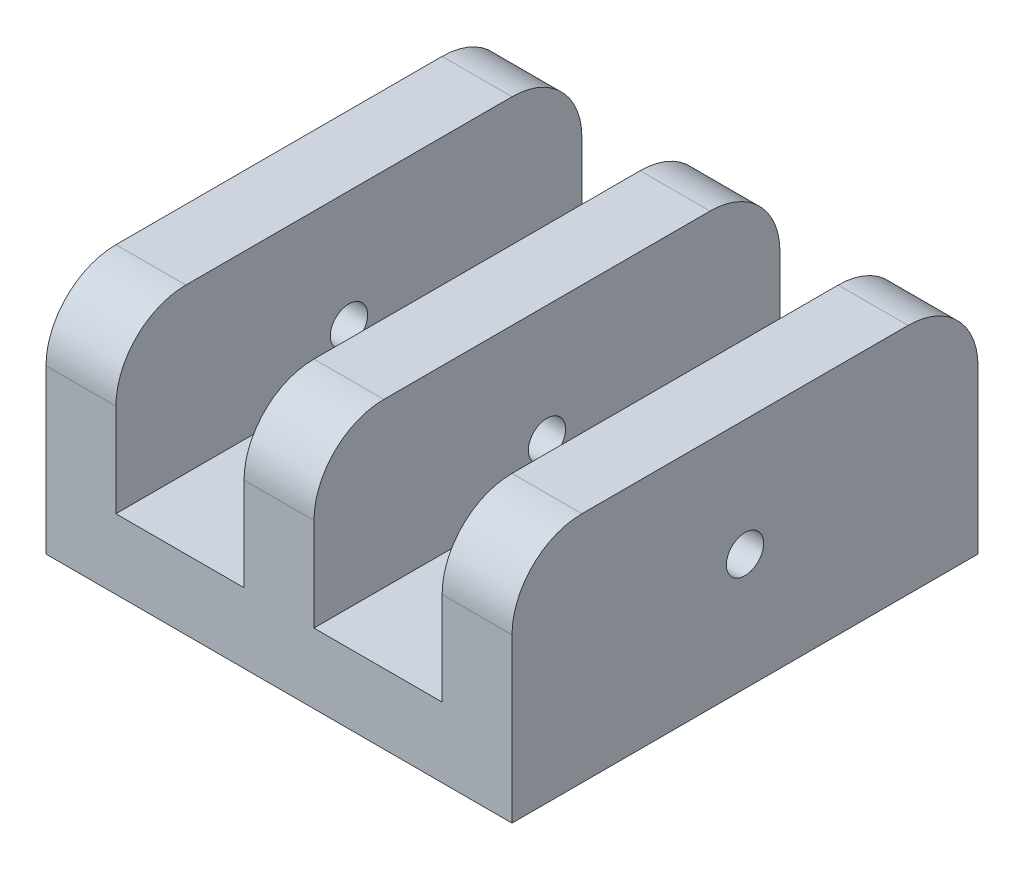
ISO-10303-21;
HEADER;
FILE_DESCRIPTION(('STEP AP214'),'2;1');
FILE_NAME('part.step','',(''),(''),'','','');
FILE_SCHEMA(('AUTOMOTIVE_DESIGN { 1 0 10303 214 1 1 1 1 }'));
ENDSEC;
DATA;
#1=APPLICATION_CONTEXT('core data for automotive mechanical design processes');
#2=APPLICATION_PROTOCOL_DEFINITION('international standard','automotive_design',2000,#1);
#3=PRODUCT_CONTEXT('',#1,'mechanical');
#4=PRODUCT('Part','Part','',(#3));
#5=PRODUCT_RELATED_PRODUCT_CATEGORY('part','',(#4));
#6=PRODUCT_DEFINITION_FORMATION('','',#4);
#7=PRODUCT_DEFINITION_CONTEXT('part definition',#1,'design');
#8=PRODUCT_DEFINITION('design','',#6,#7);
#9=PRODUCT_DEFINITION_SHAPE('','',#8);
#10=(LENGTH_UNIT() NAMED_UNIT(*) SI_UNIT(.MILLI.,.METRE.));
#11=(NAMED_UNIT(*) PLANE_ANGLE_UNIT() SI_UNIT($,.RADIAN.));
#12=(NAMED_UNIT(*) SI_UNIT($,.STERADIAN.) SOLID_ANGLE_UNIT());
#13=UNCERTAINTY_MEASURE_WITH_UNIT(LENGTH_MEASURE(1.E-05),#10,'distance_accuracy_value','');
#14=(GEOMETRIC_REPRESENTATION_CONTEXT(3) GLOBAL_UNCERTAINTY_ASSIGNED_CONTEXT((#13)) GLOBAL_UNIT_ASSIGNED_CONTEXT((#10,
#11,#12)) REPRESENTATION_CONTEXT('',''));
#15=CARTESIAN_POINT('',(0.,0.,0.));
#16=DIRECTION('',(0.,0.,1.));
#17=DIRECTION('',(1.,0.,0.));
#18=AXIS2_PLACEMENT_3D('',#15,#16,#17);
#19=CARTESIAN_POINT('',(0.,0.,50.8));
#20=DIRECTION('',(0.,0.,1.));
#21=DIRECTION('',(1.,0.,0.));
#22=AXIS2_PLACEMENT_3D('',#19,#20,#21);
#23=PLANE('',#22);
#24=DIRECTION('',(0.,1.,0.));
#25=VECTOR('',#24,1.);
#26=CARTESIAN_POINT('',(7.62,7.62,50.8));
#27=LINE('',#26,#25);
#28=CARTESIAN_POINT('',(7.62,7.62,50.8));
#29=VERTEX_POINT('',#28);
#30=CARTESIAN_POINT('',(7.62,17.78,50.8));
#31=VERTEX_POINT('',#30);
#32=EDGE_CURVE('E267',#29,#31,#27,.T.);
#33=ORIENTED_EDGE('',*,*,#32,.T.);
#34=DIRECTION('',(-1.,0.,0.));
#35=VECTOR('',#34,1.);
#36=CARTESIAN_POINT('',(0.,17.78,50.8));
#37=LINE('',#36,#35);
#38=CARTESIAN_POINT('',(0.,17.78,50.8));
#39=VERTEX_POINT('',#38);
#40=EDGE_CURVE('E351',#31,#39,#37,.T.);
#41=ORIENTED_EDGE('',*,*,#40,.T.);
#42=DIRECTION('',(0.,-1.,0.));
#43=VECTOR('',#42,1.);
#44=CARTESIAN_POINT('',(0.,25.4,50.8));
#45=LINE('',#44,#43);
#46=CARTESIAN_POINT('',(0.,0.,50.8));
#47=VERTEX_POINT('',#46);
#48=EDGE_CURVE('E181',#39,#47,#45,.T.);
#49=ORIENTED_EDGE('',*,*,#48,.T.);
#50=DIRECTION('',(1.,0.,0.));
#51=VECTOR('',#50,1.);
#52=CARTESIAN_POINT('',(0.,0.,50.8));
#53=LINE('',#52,#51);
#54=CARTESIAN_POINT('',(50.8,0.,50.8));
#55=VERTEX_POINT('',#54);
#56=EDGE_CURVE('E184',#47,#55,#53,.T.);
#57=ORIENTED_EDGE('',*,*,#56,.T.);
#58=DIRECTION('',(0.,1.,0.));
#59=VECTOR('',#58,1.);
#60=CARTESIAN_POINT('',(50.8,0.,50.8));
#61=LINE('',#60,#59);
#62=CARTESIAN_POINT('',(50.8,17.78,50.8));
#63=VERTEX_POINT('',#62);
#64=EDGE_CURVE('E199',#55,#63,#61,.T.);
#65=ORIENTED_EDGE('',*,*,#64,.T.);
#66=DIRECTION('',(-1.,0.,0.));
#67=VECTOR('',#66,1.);
#68=CARTESIAN_POINT('',(0.,17.78,50.8));
#69=LINE('',#68,#67);
#70=CARTESIAN_POINT('',(43.18,17.78,50.8));
#71=VERTEX_POINT('',#70);
#72=EDGE_CURVE('E169',#63,#71,#69,.T.);
#73=ORIENTED_EDGE('',*,*,#72,.T.);
#74=DIRECTION('',(0.,-1.,0.));
#75=VECTOR('',#74,1.);
#76=CARTESIAN_POINT('',(43.18,25.4,50.8));
#77=LINE('',#76,#75);
#78=CARTESIAN_POINT('',(43.18,7.62000000000001,50.8));
#79=VERTEX_POINT('',#78);
#80=EDGE_CURVE('E234',#71,#79,#77,.T.);
#81=ORIENTED_EDGE('',*,*,#80,.T.);
#82=DIRECTION('',(-1.,0.,0.));
#83=VECTOR('',#82,1.);
#84=CARTESIAN_POINT('',(43.18,7.62000000000001,50.8));
#85=LINE('',#84,#83);
#86=CARTESIAN_POINT('',(29.21,7.62,50.8));
#87=VERTEX_POINT('',#86);
#88=EDGE_CURVE('E318',#79,#87,#85,.T.);
#89=ORIENTED_EDGE('',*,*,#88,.T.);
#90=DIRECTION('',(0.,1.,0.));
#91=VECTOR('',#90,1.);
#92=CARTESIAN_POINT('',(29.21,7.62,50.8));
#93=LINE('',#92,#91);
#94=CARTESIAN_POINT('',(29.21,17.78,50.8));
#95=VERTEX_POINT('',#94);
#96=EDGE_CURVE('E309',#87,#95,#93,.T.);
#97=ORIENTED_EDGE('',*,*,#96,.T.);
#98=DIRECTION('',(-1.,0.,0.));
#99=VECTOR('',#98,1.);
#100=CARTESIAN_POINT('',(0.,17.78,50.8));
#101=LINE('',#100,#99);
#102=CARTESIAN_POINT('',(21.59,17.78,50.8));
#103=VERTEX_POINT('',#102);
#104=EDGE_CURVE('E350',#95,#103,#101,.T.);
#105=ORIENTED_EDGE('',*,*,#104,.T.);
#106=DIRECTION('',(0.,-1.,0.));
#107=VECTOR('',#106,1.);
#108=CARTESIAN_POINT('',(21.59,25.4,50.8));
#109=LINE('',#108,#107);
#110=CARTESIAN_POINT('',(21.59,7.62000000000001,50.8));
#111=VERTEX_POINT('',#110);
#112=EDGE_CURVE('E239',#103,#111,#109,.T.);
#113=ORIENTED_EDGE('',*,*,#112,.T.);
#114=DIRECTION('',(-1.,0.,0.));
#115=VECTOR('',#114,1.);
#116=CARTESIAN_POINT('',(21.59,7.62000000000001,50.8));
#117=LINE('',#116,#115);
#118=EDGE_CURVE('E253',#111,#29,#117,.T.);
#119=ORIENTED_EDGE('',*,*,#118,.T.);
#120=EDGE_LOOP('',(#33,#41,#49,#57,#65,#73,#81,#89,#97,#105,#113,#119));
#121=FACE_BOUND('',#120,.T.);
#122=ADVANCED_FACE('F34',(#121),#23,.T.);
#123=CARTESIAN_POINT('',(0.,0.,0.));
#124=DIRECTION('',(0.,0.,1.));
#125=DIRECTION('',(1.,0.,0.));
#126=AXIS2_PLACEMENT_3D('',#123,#124,#125);
#127=PLANE('',#126);
#128=DIRECTION('',(0.,-1.,0.));
#129=VECTOR('',#128,1.);
#130=CARTESIAN_POINT('',(43.18,25.4,0.));
#131=LINE('',#130,#129);
#132=CARTESIAN_POINT('',(43.18,17.78,0.));
#133=VERTEX_POINT('',#132);
#134=CARTESIAN_POINT('',(43.18,7.62000000000001,0.));
#135=VERTEX_POINT('',#134);
#136=EDGE_CURVE('E217',#133,#135,#131,.T.);
#137=ORIENTED_EDGE('',*,*,#136,.F.);
#138=DIRECTION('',(-1.,0.,0.));
#139=VECTOR('',#138,1.);
#140=CARTESIAN_POINT('',(50.8,17.78,0.));
#141=LINE('',#140,#139);
#142=CARTESIAN_POINT('',(50.8,17.78,0.));
#143=VERTEX_POINT('',#142);
#144=EDGE_CURVE('E295',#133,#143,#141,.F.);
#145=ORIENTED_EDGE('',*,*,#144,.T.);
#146=DIRECTION('',(0.,1.,0.));
#147=VECTOR('',#146,1.);
#148=CARTESIAN_POINT('',(50.8,0.,0.));
#149=LINE('',#148,#147);
#150=CARTESIAN_POINT('',(50.8,0.,0.));
#151=VERTEX_POINT('',#150);
#152=EDGE_CURVE('E177',#151,#143,#149,.T.);
#153=ORIENTED_EDGE('',*,*,#152,.F.);
#154=DIRECTION('',(1.,0.,0.));
#155=VECTOR('',#154,1.);
#156=CARTESIAN_POINT('',(0.,0.,0.));
#157=LINE('',#156,#155);
#158=CARTESIAN_POINT('',(0.,0.,0.));
#159=VERTEX_POINT('',#158);
#160=EDGE_CURVE('E173',#159,#151,#157,.T.);
#161=ORIENTED_EDGE('',*,*,#160,.F.);
#162=DIRECTION('',(0.,-1.,0.));
#163=VECTOR('',#162,1.);
#164=CARTESIAN_POINT('',(0.,25.4,0.));
#165=LINE('',#164,#163);
#166=CARTESIAN_POINT('',(0.,17.78,0.));
#167=VERTEX_POINT('',#166);
#168=EDGE_CURVE('E160',#167,#159,#165,.T.);
#169=ORIENTED_EDGE('',*,*,#168,.F.);
#170=DIRECTION('',(-1.,0.,0.));
#171=VECTOR('',#170,1.);
#172=CARTESIAN_POINT('',(7.62,17.78,0.));
#173=LINE('',#172,#171);
#174=CARTESIAN_POINT('',(7.62,17.78,0.));
#175=VERTEX_POINT('',#174);
#176=EDGE_CURVE('E291',#167,#175,#173,.F.);
#177=ORIENTED_EDGE('',*,*,#176,.T.);
#178=DIRECTION('',(0.,1.,0.));
#179=VECTOR('',#178,1.);
#180=CARTESIAN_POINT('',(7.62,7.62,0.));
#181=LINE('',#180,#179);
#182=CARTESIAN_POINT('',(7.62,7.62,0.));
#183=VERTEX_POINT('',#182);
#184=EDGE_CURVE('E266',#183,#175,#181,.T.);
#185=ORIENTED_EDGE('',*,*,#184,.F.);
#186=DIRECTION('',(-1.,0.,0.));
#187=VECTOR('',#186,1.);
#188=CARTESIAN_POINT('',(21.59,7.62000000000001,0.));
#189=LINE('',#188,#187);
#190=CARTESIAN_POINT('',(21.59,7.62000000000001,0.));
#191=VERTEX_POINT('',#190);
#192=EDGE_CURVE('E243',#191,#183,#189,.T.);
#193=ORIENTED_EDGE('',*,*,#192,.F.);
#194=DIRECTION('',(0.,-1.,0.));
#195=VECTOR('',#194,1.);
#196=CARTESIAN_POINT('',(21.59,25.4,0.));
#197=LINE('',#196,#195);
#198=CARTESIAN_POINT('',(21.59,17.78,0.));
#199=VERTEX_POINT('',#198);
#200=EDGE_CURVE('E290',#199,#191,#197,.T.);
#201=ORIENTED_EDGE('',*,*,#200,.F.);
#202=DIRECTION('',(-1.,0.,0.));
#203=VECTOR('',#202,1.);
#204=CARTESIAN_POINT('',(29.21,17.78,0.));
#205=LINE('',#204,#203);
#206=CARTESIAN_POINT('',(29.21,17.78,0.));
#207=VERTEX_POINT('',#206);
#208=EDGE_CURVE('E293',#199,#207,#205,.F.);
#209=ORIENTED_EDGE('',*,*,#208,.T.);
#210=DIRECTION('',(0.,1.,0.));
#211=VECTOR('',#210,1.);
#212=CARTESIAN_POINT('',(29.21,7.62,0.));
#213=LINE('',#212,#211);
#214=CARTESIAN_POINT('',(29.21,7.62,0.));
#215=VERTEX_POINT('',#214);
#216=EDGE_CURVE('E315',#215,#207,#213,.T.);
#217=ORIENTED_EDGE('',*,*,#216,.F.);
#218=DIRECTION('',(-1.,0.,0.));
#219=VECTOR('',#218,1.);
#220=CARTESIAN_POINT('',(43.18,7.62000000000001,0.));
#221=LINE('',#220,#219);
#222=EDGE_CURVE('E237',#135,#215,#221,.T.);
#223=ORIENTED_EDGE('',*,*,#222,.F.);
#224=EDGE_LOOP('',(#137,#145,#153,#161,#169,#177,#185,#193,#201,#209,#217,#223));
#225=FACE_BOUND('',#224,.T.);
#226=ADVANCED_FACE('F175',(#225),#127,.F.);
#227=CARTESIAN_POINT('',(7.62,7.62,0.));
#228=DIRECTION('',(1.,0.,0.));
#229=DIRECTION('',(0.,1.,0.));
#230=AXIS2_PLACEMENT_3D('',#227,#228,#229);
#231=PLANE('',#230);
#232=CARTESIAN_POINT('',(7.62,12.7,25.4));
#233=DIRECTION('',(1.,0.,0.));
#234=DIRECTION('',(0.,1.,0.));
#235=AXIS2_PLACEMENT_3D('',#232,#233,#234);
#236=CIRCLE('',#235,2.032);
#237=CARTESIAN_POINT('',(7.62,14.732,25.4));
#238=VERTEX_POINT('',#237);
#239=EDGE_CURVE('E459',#238,#238,#236,.T.);
#240=ORIENTED_EDGE('',*,*,#239,.F.);
#241=EDGE_LOOP('',(#240));
#242=FACE_BOUND('',#241,.T.);
#243=ORIENTED_EDGE('',*,*,#184,.T.);
#244=CARTESIAN_POINT('',(7.62,17.78,7.62));
#245=DIRECTION('',(1.,0.,0.));
#246=DIRECTION('',(0.,1.,0.));
#247=AXIS2_PLACEMENT_3D('',#244,#245,#246);
#248=CIRCLE('',#247,7.62);
#249=CARTESIAN_POINT('',(7.62,25.4,7.62));
#250=VERTEX_POINT('',#249);
#251=EDGE_CURVE('E12',#175,#250,#248,.T.);
#252=ORIENTED_EDGE('',*,*,#251,.T.);
#253=DIRECTION('',(0.,0.,1.));
#254=VECTOR('',#253,1.);
#255=CARTESIAN_POINT('',(7.62,25.4,0.));
#256=LINE('',#255,#254);
#257=CARTESIAN_POINT('',(7.62,25.4,43.18));
#258=VERTEX_POINT('',#257);
#259=EDGE_CURVE('E261',#250,#258,#256,.T.);
#260=ORIENTED_EDGE('',*,*,#259,.T.);
#261=CARTESIAN_POINT('',(7.62,17.78,43.18));
#262=DIRECTION('',(1.,0.,0.));
#263=DIRECTION('',(0.,1.,0.));
#264=AXIS2_PLACEMENT_3D('',#261,#262,#263);
#265=CIRCLE('',#264,7.62);
#266=EDGE_CURVE('E361',#258,#31,#265,.T.);
#267=ORIENTED_EDGE('',*,*,#266,.T.);
#268=ORIENTED_EDGE('',*,*,#32,.F.);
#269=DIRECTION('',(0.,0.,1.));
#270=VECTOR('',#269,1.);
#271=CARTESIAN_POINT('',(7.62,7.62,0.));
#272=LINE('',#271,#270);
#273=EDGE_CURVE('E264',#183,#29,#272,.T.);
#274=ORIENTED_EDGE('',*,*,#273,.F.);
#275=EDGE_LOOP('',(#243,#252,#260,#267,#268,#274));
#276=FACE_BOUND('',#275,.T.);
#277=ADVANCED_FACE('F414',(#242,#276),#231,.T.);
#278=CARTESIAN_POINT('',(21.59,7.62000000000001,0.));
#279=DIRECTION('',(0.,1.,0.));
#280=DIRECTION('',(-1.,0.,0.));
#281=AXIS2_PLACEMENT_3D('',#278,#279,#280);
#282=PLANE('',#281);
#283=CARTESIAN_POINT('',(14.605,7.62,25.4));
#284=DIRECTION('',(0.,1.,0.));
#285=DIRECTION('',(-1.,0.,0.));
#286=AXIS2_PLACEMENT_3D('',#283,#284,#285);
#287=CIRCLE('',#286,0.5334);
#288=CARTESIAN_POINT('',(14.0716,7.62,25.4));
#289=VERTEX_POINT('',#288);
#290=EDGE_CURVE('E281',#289,#289,#287,.T.);
#291=ORIENTED_EDGE('',*,*,#290,.F.);
#292=EDGE_LOOP('',(#291));
#293=FACE_BOUND('',#292,.T.);
#294=ORIENTED_EDGE('',*,*,#118,.F.);
#295=DIRECTION('',(0.,0.,1.));
#296=VECTOR('',#295,1.);
#297=CARTESIAN_POINT('',(21.59,7.62000000000001,0.));
#298=LINE('',#297,#296);
#299=EDGE_CURVE('E250',#191,#111,#298,.T.);
#300=ORIENTED_EDGE('',*,*,#299,.F.);
#301=ORIENTED_EDGE('',*,*,#192,.T.);
#302=ORIENTED_EDGE('',*,*,#273,.T.);
#303=EDGE_LOOP('',(#294,#300,#301,#302));
#304=FACE_BOUND('',#303,.T.);
#305=ADVANCED_FACE('F436',(#293,#304),#282,.T.);
#306=CARTESIAN_POINT('',(21.59,25.4,0.));
#307=DIRECTION('',(-1.,0.,0.));
#308=DIRECTION('',(0.,-1.,0.));
#309=AXIS2_PLACEMENT_3D('',#306,#307,#308);
#310=PLANE('',#309);
#311=CARTESIAN_POINT('',(21.59,12.7,25.4));
#312=DIRECTION('',(-1.,0.,0.));
#313=DIRECTION('',(0.,-1.,0.));
#314=AXIS2_PLACEMENT_3D('',#311,#312,#313);
#315=CIRCLE('',#314,2.032);
#316=CARTESIAN_POINT('',(21.59,10.668,25.4));
#317=VERTEX_POINT('',#316);
#318=EDGE_CURVE('E462',#317,#317,#315,.T.);
#319=ORIENTED_EDGE('',*,*,#318,.F.);
#320=EDGE_LOOP('',(#319));
#321=FACE_BOUND('',#320,.T.);
#322=DIRECTION('',(0.,0.,1.));
#323=VECTOR('',#322,1.);
#324=CARTESIAN_POINT('',(21.59,25.4,0.));
#325=LINE('',#324,#323);
#326=CARTESIAN_POINT('',(21.59,25.4,7.62));
#327=VERTEX_POINT('',#326);
#328=CARTESIAN_POINT('',(21.59,25.4,43.18));
#329=VERTEX_POINT('',#328);
#330=EDGE_CURVE('E242',#327,#329,#325,.T.);
#331=ORIENTED_EDGE('',*,*,#330,.F.);
#332=CARTESIAN_POINT('',(21.59,17.78,7.62));
#333=DIRECTION('',(-1.,0.,0.));
#334=DIRECTION('',(0.,-1.,0.));
#335=AXIS2_PLACEMENT_3D('',#332,#333,#334);
#336=CIRCLE('',#335,7.62);
#337=EDGE_CURVE('E678',#327,#199,#336,.T.);
#338=ORIENTED_EDGE('',*,*,#337,.T.);
#339=ORIENTED_EDGE('',*,*,#200,.T.);
#340=ORIENTED_EDGE('',*,*,#299,.T.);
#341=ORIENTED_EDGE('',*,*,#112,.F.);
#342=CARTESIAN_POINT('',(21.59,17.78,43.18));
#343=DIRECTION('',(-1.,0.,0.));
#344=DIRECTION('',(0.,-1.,0.));
#345=AXIS2_PLACEMENT_3D('',#342,#343,#344);
#346=CIRCLE('',#345,7.62);
#347=EDGE_CURVE('E363',#103,#329,#346,.T.);
#348=ORIENTED_EDGE('',*,*,#347,.T.);
#349=EDGE_LOOP('',(#331,#338,#339,#340,#341,#348));
#350=FACE_BOUND('',#349,.T.);
#351=ADVANCED_FACE('F434',(#321,#350),#310,.T.);
#352=CARTESIAN_POINT('',(29.21,25.4,0.));
#353=DIRECTION('',(0.,1.,0.));
#354=DIRECTION('',(0.,0.,1.));
#355=AXIS2_PLACEMENT_3D('',#352,#353,#354);
#356=PLANE('',#355);
#357=DIRECTION('',(0.,0.,1.));
#358=VECTOR('',#357,1.);
#359=CARTESIAN_POINT('',(29.21,25.4,0.));
#360=LINE('',#359,#358);
#361=CARTESIAN_POINT('',(29.21,25.4,7.62));
#362=VERTEX_POINT('',#361);
#363=CARTESIAN_POINT('',(29.21,25.4,43.18));
#364=VERTEX_POINT('',#363);
#365=EDGE_CURVE('E301',#362,#364,#360,.T.);
#366=ORIENTED_EDGE('',*,*,#365,.F.);
#367=DIRECTION('',(-1.,0.,0.));
#368=VECTOR('',#367,1.);
#369=CARTESIAN_POINT('',(21.59,25.4,7.62));
#370=LINE('',#369,#368);
#371=EDGE_CURVE('E299',#362,#327,#370,.T.);
#372=ORIENTED_EDGE('',*,*,#371,.T.);
#373=ORIENTED_EDGE('',*,*,#330,.T.);
#374=DIRECTION('',(-1.,0.,0.));
#375=VECTOR('',#374,1.);
#376=CARTESIAN_POINT('',(29.21,25.4,43.18));
#377=LINE('',#376,#375);
#378=EDGE_CURVE('E366',#329,#364,#377,.F.);
#379=ORIENTED_EDGE('',*,*,#378,.T.);
#380=EDGE_LOOP('',(#366,#372,#373,#379));
#381=FACE_BOUND('',#380,.T.);
#382=ADVANCED_FACE('F431',(#381),#356,.T.);
#383=CARTESIAN_POINT('',(29.21,7.62,0.));
#384=DIRECTION('',(1.,0.,0.));
#385=DIRECTION('',(0.,1.,0.));
#386=AXIS2_PLACEMENT_3D('',#383,#384,#385);
#387=PLANE('',#386);
#388=CARTESIAN_POINT('',(29.21,12.7,25.4));
#389=DIRECTION('',(1.,0.,0.));
#390=DIRECTION('',(0.,1.,0.));
#391=AXIS2_PLACEMENT_3D('',#388,#389,#390);
#392=CIRCLE('',#391,2.032);
#393=CARTESIAN_POINT('',(29.21,14.732,25.4));
#394=VERTEX_POINT('',#393);
#395=EDGE_CURVE('E465',#394,#394,#392,.T.);
#396=ORIENTED_EDGE('',*,*,#395,.F.);
#397=EDGE_LOOP('',(#396));
#398=FACE_BOUND('',#397,.T.);
#399=ORIENTED_EDGE('',*,*,#216,.T.);
#400=CARTESIAN_POINT('',(29.21,17.78,7.62));
#401=DIRECTION('',(1.,0.,0.));
#402=DIRECTION('',(0.,1.,0.));
#403=AXIS2_PLACEMENT_3D('',#400,#401,#402);
#404=CIRCLE('',#403,7.62);
#405=EDGE_CURVE('E427',#207,#362,#404,.T.);
#406=ORIENTED_EDGE('',*,*,#405,.T.);
#407=ORIENTED_EDGE('',*,*,#365,.T.);
#408=CARTESIAN_POINT('',(29.21,17.78,43.18));
#409=DIRECTION('',(1.,0.,0.));
#410=DIRECTION('',(0.,1.,0.));
#411=AXIS2_PLACEMENT_3D('',#408,#409,#410);
#412=CIRCLE('',#411,7.62);
#413=EDGE_CURVE('E369',#364,#95,#412,.T.);
#414=ORIENTED_EDGE('',*,*,#413,.T.);
#415=ORIENTED_EDGE('',*,*,#96,.F.);
#416=DIRECTION('',(0.,0.,1.));
#417=VECTOR('',#416,1.);
#418=CARTESIAN_POINT('',(29.21,7.62,0.));
#419=LINE('',#418,#417);
#420=EDGE_CURVE('E312',#215,#87,#419,.T.);
#421=ORIENTED_EDGE('',*,*,#420,.F.);
#422=EDGE_LOOP('',(#399,#406,#407,#414,#415,#421));
#423=FACE_BOUND('',#422,.T.);
#424=ADVANCED_FACE('F424',(#398,#423),#387,.T.);
#425=CARTESIAN_POINT('',(43.18,7.62000000000001,0.));
#426=DIRECTION('',(0.,1.,0.));
#427=DIRECTION('',(-1.,0.,0.));
#428=AXIS2_PLACEMENT_3D('',#425,#426,#427);
#429=PLANE('',#428);
#430=CARTESIAN_POINT('',(36.195,7.62000000000001,25.4));
#431=DIRECTION('',(0.,1.,0.));
#432=DIRECTION('',(-1.,0.,0.));
#433=AXIS2_PLACEMENT_3D('',#430,#431,#432);
#434=CIRCLE('',#433,0.533400000000005);
#435=CARTESIAN_POINT('',(35.6616,7.62000000000001,25.4));
#436=VERTEX_POINT('',#435);
#437=EDGE_CURVE('E456',#436,#436,#434,.T.);
#438=ORIENTED_EDGE('',*,*,#437,.F.);
#439=EDGE_LOOP('',(#438));
#440=FACE_BOUND('',#439,.T.);
#441=ORIENTED_EDGE('',*,*,#88,.F.);
#442=DIRECTION('',(0.,0.,1.));
#443=VECTOR('',#442,1.);
#444=CARTESIAN_POINT('',(43.18,7.62000000000001,0.));
#445=LINE('',#444,#443);
#446=EDGE_CURVE('E231',#135,#79,#445,.T.);
#447=ORIENTED_EDGE('',*,*,#446,.F.);
#448=ORIENTED_EDGE('',*,*,#222,.T.);
#449=ORIENTED_EDGE('',*,*,#420,.T.);
#450=EDGE_LOOP('',(#441,#447,#448,#449));
#451=FACE_BOUND('',#450,.T.);
#452=ADVANCED_FACE('F340',(#440,#451),#429,.T.);
#453=CARTESIAN_POINT('',(43.18,25.4,0.));
#454=DIRECTION('',(-1.,0.,0.));
#455=DIRECTION('',(0.,0.,1.));
#456=AXIS2_PLACEMENT_3D('',#453,#454,#455);
#457=PLANE('',#456);
#458=CARTESIAN_POINT('',(43.18,12.7,25.4));
#459=DIRECTION('',(-1.,0.,0.));
#460=DIRECTION('',(0.,0.,1.));
#461=AXIS2_PLACEMENT_3D('',#458,#459,#460);
#462=CIRCLE('',#461,2.032);
#463=CARTESIAN_POINT('',(43.18,12.7,27.432));
#464=VERTEX_POINT('',#463);
#465=EDGE_CURVE('E468',#464,#464,#462,.T.);
#466=ORIENTED_EDGE('',*,*,#465,.F.);
#467=EDGE_LOOP('',(#466));
#468=FACE_BOUND('',#467,.T.);
#469=DIRECTION('',(0.,0.,1.));
#470=VECTOR('',#469,1.);
#471=CARTESIAN_POINT('',(43.18,25.4,0.));
#472=LINE('',#471,#470);
#473=CARTESIAN_POINT('',(43.18,25.4,7.62));
#474=VERTEX_POINT('',#473);
#475=CARTESIAN_POINT('',(43.18,25.4,43.18));
#476=VERTEX_POINT('',#475);
#477=EDGE_CURVE('E218',#474,#476,#472,.T.);
#478=ORIENTED_EDGE('',*,*,#477,.F.);
#479=CARTESIAN_POINT('',(43.18,17.78,7.62));
#480=DIRECTION('',(-1.,0.,0.));
#481=DIRECTION('',(0.,0.,1.));
#482=AXIS2_PLACEMENT_3D('',#479,#480,#481);
#483=CIRCLE('',#482,7.62);
#484=EDGE_CURVE('E223',#474,#133,#483,.T.);
#485=ORIENTED_EDGE('',*,*,#484,.T.);
#486=ORIENTED_EDGE('',*,*,#136,.T.);
#487=ORIENTED_EDGE('',*,*,#446,.T.);
#488=ORIENTED_EDGE('',*,*,#80,.F.);
#489=CARTESIAN_POINT('',(43.18,17.78,43.18));
#490=DIRECTION('',(-1.,0.,0.));
#491=DIRECTION('',(0.,0.,1.));
#492=AXIS2_PLACEMENT_3D('',#489,#490,#491);
#493=CIRCLE('',#492,7.62);
#494=EDGE_CURVE('E371',#71,#476,#493,.T.);
#495=ORIENTED_EDGE('',*,*,#494,.T.);
#496=EDGE_LOOP('',(#478,#485,#486,#487,#488,#495));
#497=FACE_BOUND('',#496,.T.);
#498=ADVANCED_FACE('F338',(#468,#497),#457,.T.);
#499=CARTESIAN_POINT('',(50.8,25.4,0.));
#500=DIRECTION('',(0.,1.,0.));
#501=DIRECTION('',(-1.,0.,0.));
#502=AXIS2_PLACEMENT_3D('',#499,#500,#501);
#503=PLANE('',#502);
#504=DIRECTION('',(0.,0.,1.));
#505=VECTOR('',#504,1.);
#506=CARTESIAN_POINT('',(50.8,25.4,0.));
#507=LINE('',#506,#505);
#508=CARTESIAN_POINT('',(50.8,25.4,7.62));
#509=VERTEX_POINT('',#508);
#510=CARTESIAN_POINT('',(50.8,25.4,43.18));
#511=VERTEX_POINT('',#510);
#512=EDGE_CURVE('E207',#509,#511,#507,.T.);
#513=ORIENTED_EDGE('',*,*,#512,.F.);
#514=DIRECTION('',(-1.,0.,0.));
#515=VECTOR('',#514,1.);
#516=CARTESIAN_POINT('',(43.18,25.4,7.62));
#517=LINE('',#516,#515);
#518=EDGE_CURVE('E220',#509,#474,#517,.T.);
#519=ORIENTED_EDGE('',*,*,#518,.T.);
#520=ORIENTED_EDGE('',*,*,#477,.T.);
#521=DIRECTION('',(-1.,0.,0.));
#522=VECTOR('',#521,1.);
#523=CARTESIAN_POINT('',(50.8,25.4,43.18));
#524=LINE('',#523,#522);
#525=EDGE_CURVE('E373',#476,#511,#524,.F.);
#526=ORIENTED_EDGE('',*,*,#525,.T.);
#527=EDGE_LOOP('',(#513,#519,#520,#526));
#528=FACE_BOUND('',#527,.T.);
#529=ADVANCED_FACE('F381',(#528),#503,.T.);
#530=CARTESIAN_POINT('',(50.8,0.,0.));
#531=DIRECTION('',(1.,0.,0.));
#532=DIRECTION('',(0.,0.,-1.));
#533=AXIS2_PLACEMENT_3D('',#530,#531,#532);
#534=PLANE('',#533);
#535=CARTESIAN_POINT('',(50.8,12.7,25.4));
#536=DIRECTION('',(1.,0.,0.));
#537=DIRECTION('',(0.,0.,-1.));
#538=AXIS2_PLACEMENT_3D('',#535,#536,#537);
#539=CIRCLE('',#538,2.032);
#540=CARTESIAN_POINT('',(50.8,12.7,23.368));
#541=VERTEX_POINT('',#540);
#542=EDGE_CURVE('E471',#541,#541,#539,.T.);
#543=ORIENTED_EDGE('',*,*,#542,.F.);
#544=EDGE_LOOP('',(#543));
#545=FACE_BOUND('',#544,.T.);
#546=ORIENTED_EDGE('',*,*,#152,.T.);
#547=CARTESIAN_POINT('',(50.8,17.78,7.62));
#548=DIRECTION('',(1.,0.,0.));
#549=DIRECTION('',(0.,0.,-1.));
#550=AXIS2_PLACEMENT_3D('',#547,#548,#549);
#551=CIRCLE('',#550,7.62);
#552=EDGE_CURVE('E297',#143,#509,#551,.T.);
#553=ORIENTED_EDGE('',*,*,#552,.T.);
#554=ORIENTED_EDGE('',*,*,#512,.T.);
#555=CARTESIAN_POINT('',(50.8,17.78,43.18));
#556=DIRECTION('',(1.,0.,0.));
#557=DIRECTION('',(0.,0.,-1.));
#558=AXIS2_PLACEMENT_3D('',#555,#556,#557);
#559=CIRCLE('',#558,7.62);
#560=EDGE_CURVE('E224',#511,#63,#559,.T.);
#561=ORIENTED_EDGE('',*,*,#560,.T.);
#562=ORIENTED_EDGE('',*,*,#64,.F.);
#563=DIRECTION('',(0.,0.,1.));
#564=VECTOR('',#563,1.);
#565=CARTESIAN_POINT('',(50.8,0.,0.));
#566=LINE('',#565,#564);
#567=EDGE_CURVE('E197',#151,#55,#566,.T.);
#568=ORIENTED_EDGE('',*,*,#567,.F.);
#569=EDGE_LOOP('',(#546,#553,#554,#561,#562,#568));
#570=FACE_BOUND('',#569,.T.);
#571=ADVANCED_FACE('F376',(#545,#570),#534,.T.);
#572=CARTESIAN_POINT('',(0.,0.,0.));
#573=DIRECTION('',(0.,-1.,0.));
#574=DIRECTION('',(0.,0.,-1.));
#575=AXIS2_PLACEMENT_3D('',#572,#573,#574);
#576=PLANE('',#575);
#577=CARTESIAN_POINT('',(36.195,0.,25.4));
#578=DIRECTION('',(0.,-1.,0.));
#579=DIRECTION('',(0.,0.,-1.));
#580=AXIS2_PLACEMENT_3D('',#577,#578,#579);
#581=CIRCLE('',#580,0.533400000000005);
#582=CARTESIAN_POINT('',(36.195,0.,24.8666));
#583=VERTEX_POINT('',#582);
#584=EDGE_CURVE('E455',#583,#583,#581,.T.);
#585=ORIENTED_EDGE('',*,*,#584,.F.);
#586=EDGE_LOOP('',(#585));
#587=FACE_BOUND('',#586,.T.);
#588=CARTESIAN_POINT('',(14.605,0.,25.4));
#589=DIRECTION('',(0.,-1.,0.));
#590=DIRECTION('',(0.,0.,-1.));
#591=AXIS2_PLACEMENT_3D('',#588,#589,#590);
#592=CIRCLE('',#591,0.5334);
#593=CARTESIAN_POINT('',(14.605,0.,24.8666));
#594=VERTEX_POINT('',#593);
#595=EDGE_CURVE('E275',#594,#594,#592,.T.);
#596=ORIENTED_EDGE('',*,*,#595,.F.);
#597=EDGE_LOOP('',(#596));
#598=FACE_BOUND('',#597,.T.);
#599=ORIENTED_EDGE('',*,*,#56,.F.);
#600=DIRECTION('',(0.,0.,1.));
#601=VECTOR('',#600,1.);
#602=CARTESIAN_POINT('',(0.,0.,0.));
#603=LINE('',#602,#601);
#604=EDGE_CURVE('E166',#159,#47,#603,.T.);
#605=ORIENTED_EDGE('',*,*,#604,.F.);
#606=ORIENTED_EDGE('',*,*,#160,.T.);
#607=ORIENTED_EDGE('',*,*,#567,.T.);
#608=EDGE_LOOP('',(#599,#605,#606,#607));
#609=FACE_BOUND('',#608,.T.);
#610=ADVANCED_FACE('F183',(#587,#598,#609),#576,.T.);
#611=CARTESIAN_POINT('',(0.,25.4,0.));
#612=DIRECTION('',(-1.,0.,0.));
#613=DIRECTION('',(0.,-1.,0.));
#614=AXIS2_PLACEMENT_3D('',#611,#612,#613);
#615=PLANE('',#614);
#616=CARTESIAN_POINT('',(0.,12.7,25.4));
#617=DIRECTION('',(-1.,0.,0.));
#618=DIRECTION('',(0.,-1.,0.));
#619=AXIS2_PLACEMENT_3D('',#616,#617,#618);
#620=CIRCLE('',#619,2.032);
#621=CARTESIAN_POINT('',(0.,10.668,25.4));
#622=VERTEX_POINT('',#621);
#623=EDGE_CURVE('E38',#622,#622,#620,.T.);
#624=ORIENTED_EDGE('',*,*,#623,.F.);
#625=EDGE_LOOP('',(#624));
#626=FACE_BOUND('',#625,.T.);
#627=DIRECTION('',(0.,0.,1.));
#628=VECTOR('',#627,1.);
#629=CARTESIAN_POINT('',(0.,25.4,0.));
#630=LINE('',#629,#628);
#631=CARTESIAN_POINT('',(0.,25.4,7.62));
#632=VERTEX_POINT('',#631);
#633=CARTESIAN_POINT('',(0.,25.4,43.18));
#634=VERTEX_POINT('',#633);
#635=EDGE_CURVE('E170',#632,#634,#630,.T.);
#636=ORIENTED_EDGE('',*,*,#635,.F.);
#637=CARTESIAN_POINT('',(0.,17.78,7.62));
#638=DIRECTION('',(-1.,0.,0.));
#639=DIRECTION('',(0.,-1.,0.));
#640=AXIS2_PLACEMENT_3D('',#637,#638,#639);
#641=CIRCLE('',#640,7.62);
#642=EDGE_CURVE('E43',#632,#167,#641,.T.);
#643=ORIENTED_EDGE('',*,*,#642,.T.);
#644=ORIENTED_EDGE('',*,*,#168,.T.);
#645=ORIENTED_EDGE('',*,*,#604,.T.);
#646=ORIENTED_EDGE('',*,*,#48,.F.);
#647=CARTESIAN_POINT('',(0.,17.78,43.18));
#648=DIRECTION('',(-1.,0.,0.));
#649=DIRECTION('',(0.,-1.,0.));
#650=AXIS2_PLACEMENT_3D('',#647,#648,#649);
#651=CIRCLE('',#650,7.62);
#652=EDGE_CURVE('E353',#39,#634,#651,.T.);
#653=ORIENTED_EDGE('',*,*,#652,.T.);
#654=EDGE_LOOP('',(#636,#643,#644,#645,#646,#653));
#655=FACE_BOUND('',#654,.T.);
#656=ADVANCED_FACE('F163',(#626,#655),#615,.T.);
#657=CARTESIAN_POINT('',(7.62,25.4,0.));
#658=DIRECTION('',(0.,1.,0.));
#659=DIRECTION('',(0.,0.,1.));
#660=AXIS2_PLACEMENT_3D('',#657,#658,#659);
#661=PLANE('',#660);
#662=ORIENTED_EDGE('',*,*,#259,.F.);
#663=DIRECTION('',(-1.,0.,0.));
#664=VECTOR('',#663,1.);
#665=CARTESIAN_POINT('',(0.,25.4,7.62));
#666=LINE('',#665,#664);
#667=EDGE_CURVE('E448',#250,#632,#666,.T.);
#668=ORIENTED_EDGE('',*,*,#667,.T.);
#669=ORIENTED_EDGE('',*,*,#635,.T.);
#670=DIRECTION('',(-1.,0.,0.));
#671=VECTOR('',#670,1.);
#672=CARTESIAN_POINT('',(7.62,25.4,43.18));
#673=LINE('',#672,#671);
#674=EDGE_CURVE('E358',#634,#258,#673,.F.);
#675=ORIENTED_EDGE('',*,*,#674,.T.);
#676=EDGE_LOOP('',(#662,#668,#669,#675));
#677=FACE_BOUND('',#676,.T.);
#678=ADVANCED_FACE('F397',(#677),#661,.T.);
#679=CARTESIAN_POINT('',(0.,17.78,43.18));
#680=DIRECTION('',(-1.,0.,0.));
#681=DIRECTION('',(0.,0.,1.));
#682=AXIS2_PLACEMENT_3D('',#679,#680,#681);
#683=CYLINDRICAL_SURFACE('',#682,7.62);
#684=ORIENTED_EDGE('',*,*,#266,.F.);
#685=ORIENTED_EDGE('',*,*,#674,.F.);
#686=ORIENTED_EDGE('',*,*,#652,.F.);
#687=ORIENTED_EDGE('',*,*,#40,.F.);
#688=EDGE_LOOP('',(#684,#685,#686,#687));
#689=FACE_BOUND('',#688,.T.);
#690=ADVANCED_FACE('F399',(#689),#683,.T.);
#691=CARTESIAN_POINT('',(0.,17.78,43.18));
#692=DIRECTION('',(-1.,0.,0.));
#693=DIRECTION('',(0.,0.,1.));
#694=AXIS2_PLACEMENT_3D('',#691,#692,#693);
#695=CYLINDRICAL_SURFACE('',#694,7.62);
#696=ORIENTED_EDGE('',*,*,#413,.F.);
#697=ORIENTED_EDGE('',*,*,#378,.F.);
#698=ORIENTED_EDGE('',*,*,#347,.F.);
#699=ORIENTED_EDGE('',*,*,#104,.F.);
#700=EDGE_LOOP('',(#696,#697,#698,#699));
#701=FACE_BOUND('',#700,.T.);
#702=ADVANCED_FACE('F395',(#701),#695,.T.);
#703=CARTESIAN_POINT('',(0.,17.78,43.18));
#704=DIRECTION('',(-1.,0.,0.));
#705=DIRECTION('',(0.,-1.,0.));
#706=AXIS2_PLACEMENT_3D('',#703,#704,#705);
#707=CYLINDRICAL_SURFACE('',#706,7.62);
#708=ORIENTED_EDGE('',*,*,#560,.F.);
#709=ORIENTED_EDGE('',*,*,#525,.F.);
#710=ORIENTED_EDGE('',*,*,#494,.F.);
#711=ORIENTED_EDGE('',*,*,#72,.F.);
#712=EDGE_LOOP('',(#708,#709,#710,#711));
#713=FACE_BOUND('',#712,.T.);
#714=ADVANCED_FACE('F379',(#713),#707,.T.);
#715=CARTESIAN_POINT('',(50.8,17.78,7.62));
#716=DIRECTION('',(1.,0.,0.));
#717=DIRECTION('',(0.,1.,0.));
#718=AXIS2_PLACEMENT_3D('',#715,#716,#717);
#719=CYLINDRICAL_SURFACE('',#718,7.62);
#720=ORIENTED_EDGE('',*,*,#552,.F.);
#721=ORIENTED_EDGE('',*,*,#144,.F.);
#722=ORIENTED_EDGE('',*,*,#484,.F.);
#723=ORIENTED_EDGE('',*,*,#518,.F.);
#724=EDGE_LOOP('',(#720,#721,#722,#723));
#725=FACE_BOUND('',#724,.T.);
#726=ADVANCED_FACE('F386',(#725),#719,.T.);
#727=CARTESIAN_POINT('',(29.21,17.78,7.62));
#728=DIRECTION('',(1.,0.,0.));
#729=DIRECTION('',(0.,0.,-1.));
#730=AXIS2_PLACEMENT_3D('',#727,#728,#729);
#731=CYLINDRICAL_SURFACE('',#730,7.62);
#732=ORIENTED_EDGE('',*,*,#405,.F.);
#733=ORIENTED_EDGE('',*,*,#208,.F.);
#734=ORIENTED_EDGE('',*,*,#337,.F.);
#735=ORIENTED_EDGE('',*,*,#371,.F.);
#736=EDGE_LOOP('',(#732,#733,#734,#735));
#737=FACE_BOUND('',#736,.T.);
#738=ADVANCED_FACE('F388',(#737),#731,.T.);
#739=CARTESIAN_POINT('',(7.62,17.78,7.62));
#740=DIRECTION('',(1.,0.,0.));
#741=DIRECTION('',(0.,0.,-1.));
#742=AXIS2_PLACEMENT_3D('',#739,#740,#741);
#743=CYLINDRICAL_SURFACE('',#742,7.62);
#744=ORIENTED_EDGE('',*,*,#251,.F.);
#745=ORIENTED_EDGE('',*,*,#176,.F.);
#746=ORIENTED_EDGE('',*,*,#642,.F.);
#747=ORIENTED_EDGE('',*,*,#667,.F.);
#748=EDGE_LOOP('',(#744,#745,#746,#747));
#749=FACE_BOUND('',#748,.T.);
#750=ADVANCED_FACE('F36',(#749),#743,.T.);
#751=CARTESIAN_POINT('',(14.605,-0.000103077640697252,25.4));
#752=DIRECTION('',(0.,1.,0.));
#753=DIRECTION('',(-1.,0.,0.));
#754=AXIS2_PLACEMENT_3D('',#751,#752,#753);
#755=CYLINDRICAL_SURFACE('',#754,0.5334);
#756=ORIENTED_EDGE('',*,*,#595,.T.);
#757=EDGE_LOOP('',(#756));
#758=FACE_BOUND('',#757,.T.);
#759=ORIENTED_EDGE('',*,*,#290,.T.);
#760=EDGE_LOOP('',(#759));
#761=FACE_BOUND('',#760,.T.);
#762=ADVANCED_FACE('F490',(#758,#761),#755,.F.);
#763=CARTESIAN_POINT('',(36.195,-0.000103077640692048,25.4));
#764=DIRECTION('',(0.,1.,0.));
#765=DIRECTION('',(-1.,0.,0.));
#766=AXIS2_PLACEMENT_3D('',#763,#764,#765);
#767=CYLINDRICAL_SURFACE('',#766,0.533400000000005);
#768=ORIENTED_EDGE('',*,*,#584,.T.);
#769=EDGE_LOOP('',(#768));
#770=FACE_BOUND('',#769,.T.);
#771=ORIENTED_EDGE('',*,*,#437,.T.);
#772=EDGE_LOOP('',(#771));
#773=FACE_BOUND('',#772,.T.);
#774=ADVANCED_FACE('F481',(#770,#773),#767,.F.);
#775=CARTESIAN_POINT('',(-0.000103077640672966,12.7,25.4));
#776=DIRECTION('',(1.,0.,0.));
#777=DIRECTION('',(0.,0.,-1.));
#778=AXIS2_PLACEMENT_3D('',#775,#776,#777);
#779=CYLINDRICAL_SURFACE('',#778,2.032);
#780=ORIENTED_EDGE('',*,*,#239,.T.);
#781=EDGE_LOOP('',(#780));
#782=FACE_BOUND('',#781,.T.);
#783=ORIENTED_EDGE('',*,*,#623,.T.);
#784=EDGE_LOOP('',(#783));
#785=FACE_BOUND('',#784,.T.);
#786=ADVANCED_FACE('F478',(#782,#785),#779,.F.);
#787=ORIENTED_EDGE('',*,*,#465,.T.);
#788=EDGE_LOOP('',(#787));
#789=FACE_BOUND('',#788,.T.);
#790=ORIENTED_EDGE('',*,*,#542,.T.);
#791=EDGE_LOOP('',(#790));
#792=FACE_BOUND('',#791,.T.);
#793=ADVANCED_FACE('F480',(#789,#792),#779,.F.);
#794=ORIENTED_EDGE('',*,*,#318,.T.);
#795=EDGE_LOOP('',(#794));
#796=FACE_BOUND('',#795,.T.);
#797=ORIENTED_EDGE('',*,*,#395,.T.);
#798=EDGE_LOOP('',(#797));
#799=FACE_BOUND('',#798,.T.);
#800=ADVANCED_FACE('F484',(#796,#799),#779,.F.);
#801=CLOSED_SHELL('',(#122,#226,#277,#305,#351,#382,#424,#452,#498,#529,#571,#610,#656,#678,
#690,#702,#714,#726,#738,#750,#762,#774,#786,#793,#800));
#802=MANIFOLD_SOLID_BREP('B2',#801);
#803=ADVANCED_BREP_SHAPE_REPRESENTATION('',(#18,#802),#14);
#804=SHAPE_DEFINITION_REPRESENTATION(#9,#803);
ENDSEC;
END-ISO-10303-21;
